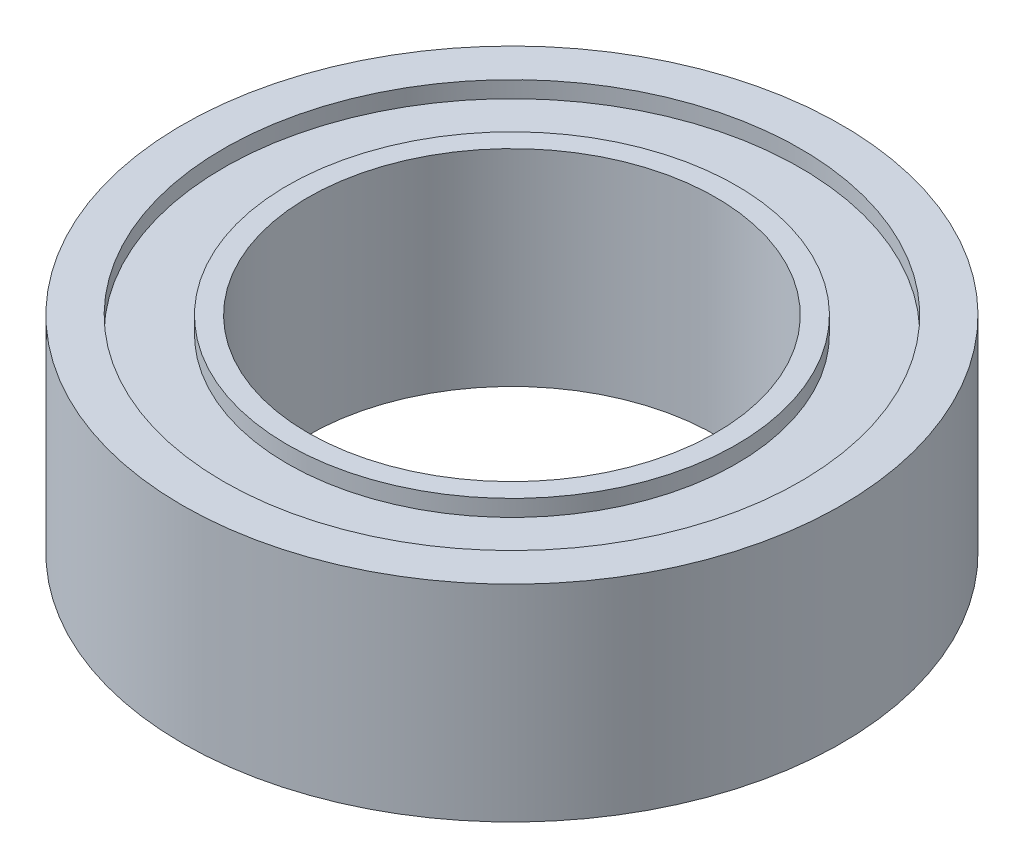
ISO-10303-21;
HEADER;
FILE_DESCRIPTION(('STEP AP214'),'2;1');
FILE_NAME('part.step','',(''),(''),'','','');
FILE_SCHEMA(('AUTOMOTIVE_DESIGN { 1 0 10303 214 1 1 1 1 }'));
ENDSEC;
DATA;
#1=APPLICATION_CONTEXT('core data for automotive mechanical design processes');
#2=APPLICATION_PROTOCOL_DEFINITION('international standard','automotive_design',2000,#1);
#3=PRODUCT_CONTEXT('',#1,'mechanical');
#4=PRODUCT('Part','Part','',(#3));
#5=PRODUCT_RELATED_PRODUCT_CATEGORY('part','',(#4));
#6=PRODUCT_DEFINITION_FORMATION('','',#4);
#7=PRODUCT_DEFINITION_CONTEXT('part definition',#1,'design');
#8=PRODUCT_DEFINITION('design','',#6,#7);
#9=PRODUCT_DEFINITION_SHAPE('','',#8);
#10=(LENGTH_UNIT() NAMED_UNIT(*) SI_UNIT(.MILLI.,.METRE.));
#11=(NAMED_UNIT(*) PLANE_ANGLE_UNIT() SI_UNIT($,.RADIAN.));
#12=(NAMED_UNIT(*) SI_UNIT($,.STERADIAN.) SOLID_ANGLE_UNIT());
#13=UNCERTAINTY_MEASURE_WITH_UNIT(LENGTH_MEASURE(1.E-05),#10,'distance_accuracy_value','');
#14=(GEOMETRIC_REPRESENTATION_CONTEXT(3) GLOBAL_UNCERTAINTY_ASSIGNED_CONTEXT((#13)) GLOBAL_UNIT_ASSIGNED_CONTEXT((#10,
#11,#12)) REPRESENTATION_CONTEXT('',''));
#15=CARTESIAN_POINT('',(0.,0.,0.));
#16=DIRECTION('',(0.,0.,1.));
#17=DIRECTION('',(1.,0.,0.));
#18=AXIS2_PLACEMENT_3D('',#15,#16,#17);
#19=CARTESIAN_POINT('',(0.,0.,0.));
#20=DIRECTION('',(0.,1.,0.));
#21=DIRECTION('',(0.,0.,1.));
#22=AXIS2_PLACEMENT_3D('',#19,#20,#21);
#23=PLANE('',#22);
#24=CARTESIAN_POINT('',(0.,0.,0.));
#25=DIRECTION('',(0.,1.,0.));
#26=DIRECTION('',(0.,0.,1.));
#27=AXIS2_PLACEMENT_3D('',#24,#25,#26);
#28=CIRCLE('',#27,2.475);
#29=CARTESIAN_POINT('',(0.,0.,2.475));
#30=VERTEX_POINT('',#29);
#31=EDGE_CURVE('E45',#30,#30,#28,.T.);
#32=ORIENTED_EDGE('',*,*,#31,.T.);
#33=EDGE_LOOP('',(#32));
#34=FACE_BOUND('',#33,.T.);
#35=CARTESIAN_POINT('',(0.,0.,0.));
#36=DIRECTION('',(0.,-1.,0.));
#37=DIRECTION('',(0.,0.,-1.));
#38=AXIS2_PLACEMENT_3D('',#35,#36,#37);
#39=CIRCLE('',#38,2.725);
#40=CARTESIAN_POINT('',(0.,0.,-2.725));
#41=VERTEX_POINT('',#40);
#42=EDGE_CURVE('E69',#41,#41,#39,.T.);
#43=ORIENTED_EDGE('',*,*,#42,.T.);
#44=EDGE_LOOP('',(#43));
#45=FACE_BOUND('',#44,.T.);
#46=ADVANCED_FACE('F32',(#34,#45),#23,.F.);
#47=CARTESIAN_POINT('',(0.,2.5,0.));
#48=DIRECTION('',(0.,1.,0.));
#49=DIRECTION('',(0.,0.,1.));
#50=AXIS2_PLACEMENT_3D('',#47,#48,#49);
#51=PLANE('',#50);
#52=CARTESIAN_POINT('',(0.,2.5,0.));
#53=DIRECTION('',(0.,1.,0.));
#54=DIRECTION('',(0.,0.,1.));
#55=AXIS2_PLACEMENT_3D('',#52,#53,#54);
#56=CIRCLE('',#55,2.475);
#57=CARTESIAN_POINT('',(0.,2.5,2.475));
#58=VERTEX_POINT('',#57);
#59=EDGE_CURVE('E43',#58,#58,#56,.T.);
#60=ORIENTED_EDGE('',*,*,#59,.F.);
#61=EDGE_LOOP('',(#60));
#62=FACE_BOUND('',#61,.T.);
#63=CARTESIAN_POINT('',(0.,2.5,0.));
#64=DIRECTION('',(0.,1.,0.));
#65=DIRECTION('',(0.,0.,1.));
#66=AXIS2_PLACEMENT_3D('',#63,#64,#65);
#67=CIRCLE('',#66,2.725);
#68=CARTESIAN_POINT('',(0.,2.5,2.725));
#69=VERTEX_POINT('',#68);
#70=EDGE_CURVE('E55',#69,#69,#67,.T.);
#71=ORIENTED_EDGE('',*,*,#70,.T.);
#72=EDGE_LOOP('',(#71));
#73=FACE_BOUND('',#72,.T.);
#74=ADVANCED_FACE('F107',(#62,#73),#51,.T.);
#75=CARTESIAN_POINT('',(0.,2.5,0.));
#76=DIRECTION('',(0.,1.,0.));
#77=DIRECTION('',(0.,0.,1.));
#78=AXIS2_PLACEMENT_3D('',#75,#76,#77);
#79=CIRCLE('',#78,3.5);
#80=CARTESIAN_POINT('',(0.,2.5,3.5));
#81=VERTEX_POINT('',#80);
#82=EDGE_CURVE('E51',#81,#81,#79,.T.);
#83=ORIENTED_EDGE('',*,*,#82,.F.);
#84=EDGE_LOOP('',(#83));
#85=FACE_BOUND('',#84,.T.);
#86=CARTESIAN_POINT('',(0.,2.5,0.));
#87=DIRECTION('',(0.,1.,0.));
#88=DIRECTION('',(0.,0.,1.));
#89=AXIS2_PLACEMENT_3D('',#86,#87,#88);
#90=CIRCLE('',#89,4.);
#91=CARTESIAN_POINT('',(0.,2.5,4.));
#92=VERTEX_POINT('',#91);
#93=EDGE_CURVE('E10',#92,#92,#90,.T.);
#94=ORIENTED_EDGE('',*,*,#93,.T.);
#95=EDGE_LOOP('',(#94));
#96=FACE_BOUND('',#95,.T.);
#97=ADVANCED_FACE('F94',(#85,#96),#51,.T.);
#98=CARTESIAN_POINT('',(0.,0.,0.));
#99=DIRECTION('',(0.,-1.,0.));
#100=DIRECTION('',(0.,0.,-1.));
#101=AXIS2_PLACEMENT_3D('',#98,#99,#100);
#102=CIRCLE('',#101,3.5);
#103=CARTESIAN_POINT('',(0.,0.,-3.5));
#104=VERTEX_POINT('',#103);
#105=EDGE_CURVE('E63',#104,#104,#102,.T.);
#106=ORIENTED_EDGE('',*,*,#105,.F.);
#107=EDGE_LOOP('',(#106));
#108=FACE_BOUND('',#107,.T.);
#109=CARTESIAN_POINT('',(0.,0.,0.));
#110=DIRECTION('',(0.,1.,0.));
#111=DIRECTION('',(0.,0.,1.));
#112=AXIS2_PLACEMENT_3D('',#109,#110,#111);
#113=CIRCLE('',#112,4.);
#114=CARTESIAN_POINT('',(0.,0.,4.));
#115=VERTEX_POINT('',#114);
#116=EDGE_CURVE('E36',#115,#115,#113,.T.);
#117=ORIENTED_EDGE('',*,*,#116,.F.);
#118=EDGE_LOOP('',(#117));
#119=FACE_BOUND('',#118,.T.);
#120=ADVANCED_FACE('F91',(#108,#119),#23,.F.);
#121=CARTESIAN_POINT('',(0.,2.5,0.));
#122=DIRECTION('',(0.,-1.,0.));
#123=DIRECTION('',(0.,0.,-1.));
#124=AXIS2_PLACEMENT_3D('',#121,#122,#123);
#125=CYLINDRICAL_SURFACE('',#124,4.);
#126=ORIENTED_EDGE('',*,*,#93,.F.);
#127=EDGE_LOOP('',(#126));
#128=FACE_BOUND('',#127,.T.);
#129=ORIENTED_EDGE('',*,*,#116,.T.);
#130=EDGE_LOOP('',(#129));
#131=FACE_BOUND('',#130,.T.);
#132=ADVANCED_FACE('F34',(#128,#131),#125,.T.);
#133=CARTESIAN_POINT('',(0.,2.5,0.));
#134=DIRECTION('',(0.,-1.,0.));
#135=DIRECTION('',(0.,0.,-1.));
#136=AXIS2_PLACEMENT_3D('',#133,#134,#135);
#137=CYLINDRICAL_SURFACE('',#136,2.475);
#138=ORIENTED_EDGE('',*,*,#59,.T.);
#139=EDGE_LOOP('',(#138));
#140=FACE_BOUND('',#139,.T.);
#141=ORIENTED_EDGE('',*,*,#31,.F.);
#142=EDGE_LOOP('',(#141));
#143=FACE_BOUND('',#142,.T.);
#144=ADVANCED_FACE('F98',(#140,#143),#137,.F.);
#145=CARTESIAN_POINT('',(0.,2.3,0.));
#146=DIRECTION('',(0.,1.,0.));
#147=DIRECTION('',(0.,0.,1.));
#148=AXIS2_PLACEMENT_3D('',#145,#146,#147);
#149=CYLINDRICAL_SURFACE('',#148,2.725);
#150=CARTESIAN_POINT('',(0.,2.3,0.));
#151=DIRECTION('',(0.,1.,0.));
#152=DIRECTION('',(0.,0.,1.));
#153=AXIS2_PLACEMENT_3D('',#150,#151,#152);
#154=CIRCLE('',#153,2.725);
#155=CARTESIAN_POINT('',(0.,2.3,2.725));
#156=VERTEX_POINT('',#155);
#157=EDGE_CURVE('E54',#156,#156,#154,.T.);
#158=ORIENTED_EDGE('',*,*,#157,.T.);
#159=EDGE_LOOP('',(#158));
#160=FACE_BOUND('',#159,.T.);
#161=ORIENTED_EDGE('',*,*,#70,.F.);
#162=EDGE_LOOP('',(#161));
#163=FACE_BOUND('',#162,.T.);
#164=ADVANCED_FACE('F103',(#160,#163),#149,.T.);
#165=CARTESIAN_POINT('',(0.,2.3,0.));
#166=DIRECTION('',(0.,1.,0.));
#167=DIRECTION('',(0.,0.,1.));
#168=AXIS2_PLACEMENT_3D('',#165,#166,#167);
#169=CYLINDRICAL_SURFACE('',#168,3.5);
#170=CARTESIAN_POINT('',(0.,2.3,0.));
#171=DIRECTION('',(0.,1.,0.));
#172=DIRECTION('',(0.,0.,1.));
#173=AXIS2_PLACEMENT_3D('',#170,#171,#172);
#174=CIRCLE('',#173,3.5);
#175=CARTESIAN_POINT('',(0.,2.3,3.5));
#176=VERTEX_POINT('',#175);
#177=EDGE_CURVE('E48',#176,#176,#174,.T.);
#178=ORIENTED_EDGE('',*,*,#177,.F.);
#179=EDGE_LOOP('',(#178));
#180=FACE_BOUND('',#179,.T.);
#181=ORIENTED_EDGE('',*,*,#82,.T.);
#182=EDGE_LOOP('',(#181));
#183=FACE_BOUND('',#182,.T.);
#184=ADVANCED_FACE('F120',(#180,#183),#169,.F.);
#185=CARTESIAN_POINT('',(0.,2.3,0.));
#186=DIRECTION('',(0.,1.,0.));
#187=DIRECTION('',(0.,0.,1.));
#188=AXIS2_PLACEMENT_3D('',#185,#186,#187);
#189=PLANE('',#188);
#190=ORIENTED_EDGE('',*,*,#157,.F.);
#191=EDGE_LOOP('',(#190));
#192=FACE_BOUND('',#191,.T.);
#193=ORIENTED_EDGE('',*,*,#177,.T.);
#194=EDGE_LOOP('',(#193));
#195=FACE_BOUND('',#194,.T.);
#196=ADVANCED_FACE('F87',(#192,#195),#189,.T.);
#197=CARTESIAN_POINT('',(0.,0.2,0.));
#198=DIRECTION('',(0.,-1.,0.));
#199=DIRECTION('',(0.,0.,-1.));
#200=AXIS2_PLACEMENT_3D('',#197,#198,#199);
#201=CYLINDRICAL_SURFACE('',#200,3.5);
#202=CARTESIAN_POINT('',(0.,0.2,0.));
#203=DIRECTION('',(0.,-1.,0.));
#204=DIRECTION('',(0.,0.,-1.));
#205=AXIS2_PLACEMENT_3D('',#202,#203,#204);
#206=CIRCLE('',#205,3.5);
#207=CARTESIAN_POINT('',(0.,0.2,-3.5));
#208=VERTEX_POINT('',#207);
#209=EDGE_CURVE('E58',#208,#208,#206,.T.);
#210=ORIENTED_EDGE('',*,*,#209,.F.);
#211=EDGE_LOOP('',(#210));
#212=FACE_BOUND('',#211,.T.);
#213=ORIENTED_EDGE('',*,*,#105,.T.);
#214=EDGE_LOOP('',(#213));
#215=FACE_BOUND('',#214,.T.);
#216=ADVANCED_FACE('F81',(#212,#215),#201,.F.);
#217=CARTESIAN_POINT('',(0.,0.2,0.));
#218=DIRECTION('',(0.,-1.,0.));
#219=DIRECTION('',(0.,0.,-1.));
#220=AXIS2_PLACEMENT_3D('',#217,#218,#219);
#221=PLANE('',#220);
#222=CARTESIAN_POINT('',(0.,0.2,0.));
#223=DIRECTION('',(0.,-1.,0.));
#224=DIRECTION('',(0.,0.,-1.));
#225=AXIS2_PLACEMENT_3D('',#222,#223,#224);
#226=CIRCLE('',#225,2.725);
#227=CARTESIAN_POINT('',(0.,0.2,-2.725));
#228=VERTEX_POINT('',#227);
#229=EDGE_CURVE('E66',#228,#228,#226,.T.);
#230=ORIENTED_EDGE('',*,*,#229,.F.);
#231=EDGE_LOOP('',(#230));
#232=FACE_BOUND('',#231,.T.);
#233=ORIENTED_EDGE('',*,*,#209,.T.);
#234=EDGE_LOOP('',(#233));
#235=FACE_BOUND('',#234,.T.);
#236=ADVANCED_FACE('F78',(#232,#235),#221,.T.);
#237=CARTESIAN_POINT('',(0.,0.2,0.));
#238=DIRECTION('',(0.,-1.,0.));
#239=DIRECTION('',(0.,0.,-1.));
#240=AXIS2_PLACEMENT_3D('',#237,#238,#239);
#241=CYLINDRICAL_SURFACE('',#240,2.725);
#242=ORIENTED_EDGE('',*,*,#229,.T.);
#243=EDGE_LOOP('',(#242));
#244=FACE_BOUND('',#243,.T.);
#245=ORIENTED_EDGE('',*,*,#42,.F.);
#246=EDGE_LOOP('',(#245));
#247=FACE_BOUND('',#246,.T.);
#248=ADVANCED_FACE('F75',(#244,#247),#241,.T.);
#249=CLOSED_SHELL('',(#46,#74,#97,#120,#132,#144,#164,#184,#196,#216,#236,#248));
#250=MANIFOLD_SOLID_BREP('B2',#249);
#251=ADVANCED_BREP_SHAPE_REPRESENTATION('',(#18,#250),#14);
#252=SHAPE_DEFINITION_REPRESENTATION(#9,#251);
ENDSEC;
END-ISO-10303-21;
